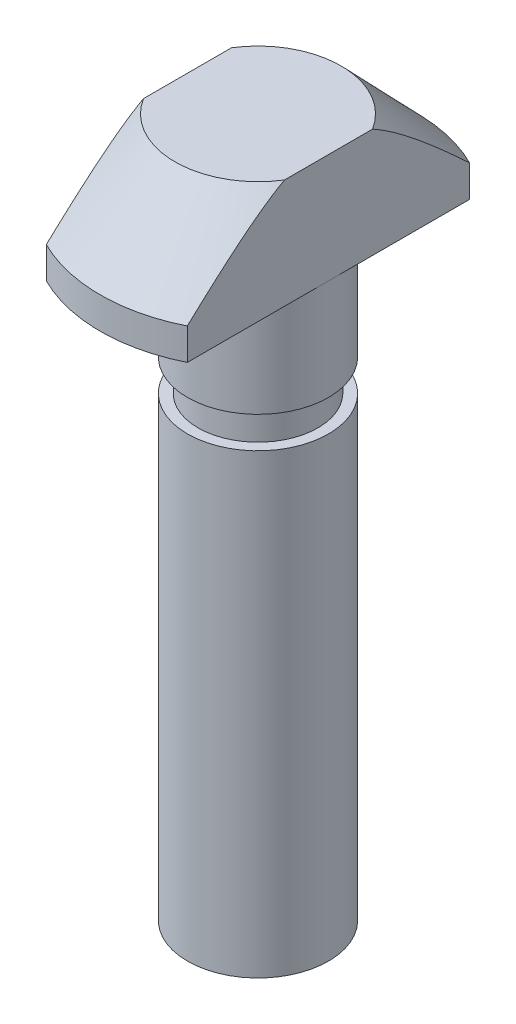
ISO-10303-21;
HEADER;
FILE_DESCRIPTION(('STEP AP214'),'2;1');
FILE_NAME('part.step','',(''),(''),'','','');
FILE_SCHEMA(('AUTOMOTIVE_DESIGN { 1 0 10303 214 1 1 1 1 }'));
ENDSEC;
DATA;
#1=APPLICATION_CONTEXT('core data for automotive mechanical design processes');
#2=APPLICATION_PROTOCOL_DEFINITION('international standard','automotive_design',2000,#1);
#3=PRODUCT_CONTEXT('',#1,'mechanical');
#4=PRODUCT('Part','Part','',(#3));
#5=PRODUCT_RELATED_PRODUCT_CATEGORY('part','',(#4));
#6=PRODUCT_DEFINITION_FORMATION('','',#4);
#7=PRODUCT_DEFINITION_CONTEXT('part definition',#1,'design');
#8=PRODUCT_DEFINITION('design','',#6,#7);
#9=PRODUCT_DEFINITION_SHAPE('','',#8);
#10=(LENGTH_UNIT() NAMED_UNIT(*) SI_UNIT(.MILLI.,.METRE.));
#11=(NAMED_UNIT(*) PLANE_ANGLE_UNIT() SI_UNIT($,.RADIAN.));
#12=(NAMED_UNIT(*) SI_UNIT($,.STERADIAN.) SOLID_ANGLE_UNIT());
#13=UNCERTAINTY_MEASURE_WITH_UNIT(LENGTH_MEASURE(1.E-05),#10,'distance_accuracy_value','');
#14=(GEOMETRIC_REPRESENTATION_CONTEXT(3) GLOBAL_UNCERTAINTY_ASSIGNED_CONTEXT((#13)) GLOBAL_UNIT_ASSIGNED_CONTEXT((#10,
#11,#12)) REPRESENTATION_CONTEXT('',''));
#15=CARTESIAN_POINT('',(0.,0.,0.));
#16=DIRECTION('',(0.,0.,1.));
#17=DIRECTION('',(1.,0.,0.));
#18=AXIS2_PLACEMENT_3D('',#15,#16,#17);
#19=CARTESIAN_POINT('',(0.,29.5,0.));
#20=DIRECTION('',(0.,-1.,0.));
#21=DIRECTION('',(0.,0.,-1.));
#22=AXIS2_PLACEMENT_3D('',#19,#20,#21);
#23=CONICAL_SURFACE('',#22,7.5,0.764711459617608);
#24=CARTESIAN_POINT('',(0.,29.5,0.));
#25=DIRECTION('',(0.,1.,0.));
#26=DIRECTION('',(0.,0.,1.));
#27=AXIS2_PLACEMENT_3D('',#24,#25,#26);
#28=CIRCLE('',#27,7.5);
#29=CARTESIAN_POINT('',(-3.34999999999999,29.5,6.71025334842136));
#30=VERTEX_POINT('',#29);
#31=CARTESIAN_POINT('',(3.34999999999999,29.5,6.71025334842138));
#32=VERTEX_POINT('',#31);
#33=EDGE_CURVE('E119',#30,#32,#28,.T.);
#34=ORIENTED_EDGE('',*,*,#33,.T.);
#35=CARTESIAN_POINT('',(3.34999999999999,20.2300427216243,16.0482271665102));
#36=CARTESIAN_POINT('',(3.34999999999999,20.6380891410871,15.6482633282209));
#37=CARTESIAN_POINT('',(3.34999999999999,21.0458438123531,15.2480010140229));
#38=CARTESIAN_POINT('',(3.34999999999999,21.8611691703313,14.4460761519081));
#39=CARTESIAN_POINT('',(3.34999999999999,22.2687386790002,14.044412406466));
#40=CARTESIAN_POINT('',(3.34999999999999,23.0934251490443,13.2296498679263));
#41=CARTESIAN_POINT('',(3.34999999999999,23.5105158381261,12.8165244684015));
#42=CARTESIAN_POINT('',(3.34999999999999,24.3426792592591,11.9894882411883));
#43=CARTESIAN_POINT('',(3.34999999999999,24.7577540768003,11.5755795132965));
#44=CARTESIAN_POINT('',(3.34999999999999,25.5435970847149,10.788362588637));
#45=CARTESIAN_POINT('',(3.34999999999999,25.9145490311669,10.4152379865853));
#46=CARTESIAN_POINT('',(3.34999999999999,26.6544441356383,9.66687328399124));
#47=CARTESIAN_POINT('',(3.34999999999999,27.0233869351847,9.29163282877394));
#48=CARTESIAN_POINT('',(3.34999999999999,27.7605535362416,8.53607849582722));
#49=CARTESIAN_POINT('',(3.34999999999999,28.128760073513,8.1557477247362));
#50=CARTESIAN_POINT('',(3.34999999999999,28.6776769145847,7.58224470195402));
#51=CARTESIAN_POINT('',(3.34999999999999,28.8600240910318,7.39063960240931));
#52=CARTESIAN_POINT('',(3.34999999999999,29.2233541715714,7.00614108804007));
#53=CARTESIAN_POINT('',(3.34999999999999,29.404337084556,6.81324768162787));
#54=CARTESIAN_POINT('',(3.34999999999999,29.7603089909152,6.43046109785213));
#55=CARTESIAN_POINT('',(3.34999999999999,29.9353382705544,6.24060543027114));
#56=CARTESIAN_POINT('',(3.34999999999999,30.2833112886384,5.85897258279413));
#57=CARTESIAN_POINT('',(3.34999999999999,30.4562549295409,5.66719531378965));
#58=CARTESIAN_POINT('',(3.34999999999999,30.7998598760466,5.28068996131222));
#59=CARTESIAN_POINT('',(3.34999999999999,30.9705139131704,5.08595540143413));
#60=CARTESIAN_POINT('',(3.34999999999999,31.3081057307192,4.69332709268464));
#61=CARTESIAN_POINT('',(3.34999999999999,31.4750440546433,4.49543381320914));
#62=CARTESIAN_POINT('',(3.34999999999999,31.8019010106499,4.09773246298403));
#63=CARTESIAN_POINT('',(3.34999999999999,31.9618784378439,3.89797288223986));
#64=CARTESIAN_POINT('',(3.34999999999999,32.2748149796803,3.49274390059992));
#65=CARTESIAN_POINT('',(3.34999999999999,32.4277693517236,3.28727078749268));
#66=CARTESIAN_POINT('',(3.34999999999999,32.6487781623789,2.97382615314163));
#67=CARTESIAN_POINT('',(3.34999999999999,32.7208890214445,2.86871776387192));
#68=CARTESIAN_POINT('',(3.34999999999999,32.8617748673896,2.65625686425381));
#69=CARTESIAN_POINT('',(3.34999999999999,32.9305494356166,2.54890407467433));
#70=CARTESIAN_POINT('',(3.34999999999999,33.0638050992787,2.33175601750872));
#71=CARTESIAN_POINT('',(3.34999999999999,33.1282918837402,2.22196425501377));
#72=CARTESIAN_POINT('',(3.34999999999999,33.2519302034503,1.99943155215));
#73=CARTESIAN_POINT('',(3.34999999999999,33.311083813302,1.88669178076409));
#74=CARTESIAN_POINT('',(3.34999999999999,33.3787832693683,1.74778811183083));
#75=CARTESIAN_POINT('',(3.34999999999999,33.3905770738496,1.72319341589388));
#76=CARTESIAN_POINT('',(3.34999999999999,33.4138363359891,1.67384492483455));
#77=CARTESIAN_POINT('',(3.34999999999999,33.4253017485224,1.649091108414));
#78=CARTESIAN_POINT('',(3.34999999999999,33.4591837205587,1.57457795367186));
#79=CARTESIAN_POINT('',(3.34999999999999,33.4810794402449,1.52458035662323));
#80=CARTESIAN_POINT('',(3.34999999999999,33.5233304187146,1.42393877890141));
#81=CARTESIAN_POINT('',(3.34999999999999,33.5436857384073,1.37329482387862));
#82=CARTESIAN_POINT('',(3.34999999999999,33.5826932964747,1.27136009093699));
#83=CARTESIAN_POINT('',(3.34999999999999,33.6013456197307,1.22006934540097));
#84=CARTESIAN_POINT('',(3.34999999999999,33.6539873483949,1.06670320255995));
#85=CARTESIAN_POINT('',(3.34999999999999,33.6852814265867,0.963678336467478));
#86=CARTESIAN_POINT('',(3.34999999999999,33.73924397427,0.755338595083958));
#87=CARTESIAN_POINT('',(3.34999999999999,33.7619099877068,0.650023076743854));
#88=CARTESIAN_POINT('',(3.34999999999999,33.7977540856108,0.435387260073001));
#89=CARTESIAN_POINT('',(3.34999999999999,33.8107139800739,0.326029740578949));
#90=CARTESIAN_POINT('',(3.34999999999999,33.8254480680524,0.106590090374744));
#91=CARTESIAN_POINT('',(3.34999999999999,33.8272263453762,-0.0034917610849074));
#92=CARTESIAN_POINT('',(3.34999999999999,33.8194783893568,-0.223301554861784));
#93=CARTESIAN_POINT('',(3.34999999999999,33.8099468876167,-0.333029308348022));
#94=CARTESIAN_POINT('',(3.34999999999999,33.7802285114262,-0.551039190091791));
#95=CARTESIAN_POINT('',(3.34999999999999,33.7600378191914,-0.659320786125009));
#96=CARTESIAN_POINT('',(3.34999999999999,33.7045986184295,-0.897809406924326));
#97=CARTESIAN_POINT('',(3.34999999999999,33.6669828158505,-1.02746142700182));
#98=CARTESIAN_POINT('',(3.34999999999999,33.5802358897141,-1.28281632743857));
#99=CARTESIAN_POINT('',(3.34999999999999,33.5311001296731,-1.40851759456076));
#100=CARTESIAN_POINT('',(3.34999999999999,33.4234739250976,-1.65678482448423));
#101=CARTESIAN_POINT('',(3.34999999999999,33.3649241262183,-1.77932475420384));
#102=CARTESIAN_POINT('',(3.34999999999999,33.2718334091075,-1.96036200010969));
#103=CARTESIAN_POINT('',(3.34999999999999,33.2399281432508,-2.0202411644373));
#104=CARTESIAN_POINT('',(3.34999999999999,33.1745644843029,-2.13914496242085));
#105=CARTESIAN_POINT('',(3.34999999999999,33.141106131472,-2.19816961817599));
#106=CARTESIAN_POINT('',(3.34999999999999,33.0405936826991,-2.37078031648078));
#107=CARTESIAN_POINT('',(3.34999999999999,32.9716456722641,-2.48326461135518));
#108=CARTESIAN_POINT('',(3.34999999999999,32.8297117136947,-2.70566621750447));
#109=CARTESIAN_POINT('',(3.34999999999999,32.7567249460468,-2.81558300131756));
#110=CARTESIAN_POINT('',(3.34999999999999,32.6075020362671,-3.03329399998297));
#111=CARTESIAN_POINT('',(3.34999999999999,32.5312636584932,-3.14108667746095));
#112=CARTESIAN_POINT('',(3.34999999999999,32.3762078454924,-3.35480496101115));
#113=CARTESIAN_POINT('',(3.34999999999999,32.2973902267042,-3.46073043336771));
#114=CARTESIAN_POINT('',(3.34999999999999,32.0574393418787,-3.77663595013612));
#115=CARTESIAN_POINT('',(3.34999999999999,31.8931676627904,-3.98423057279263));
#116=CARTESIAN_POINT('',(3.34999999999999,31.5589450605226,-4.39479691663773));
#117=CARTESIAN_POINT('',(3.34999999999999,31.3889934004019,-4.59776803216609));
#118=CARTESIAN_POINT('',(3.34999999999999,31.1305355066406,-4.90018219285906));
#119=CARTESIAN_POINT('',(3.34999999999999,31.043545130904,-5.00092655347041));
#120=CARTESIAN_POINT('',(3.34999999999999,30.8686864329241,-5.20163840994283));
#121=CARTESIAN_POINT('',(3.34999999999999,30.7808181706404,-5.30160595804222));
#122=CARTESIAN_POINT('',(3.34999999999999,30.5160603542808,-5.60052678033644));
#123=CARTESIAN_POINT('',(3.34999999999999,30.3380369779588,-5.79847587254366));
#124=CARTESIAN_POINT('',(3.34999999999999,29.9800246562448,-6.191956967731));
#125=CARTESIAN_POINT('',(3.34999999999999,29.8000396432523,-6.38749255926918));
#126=CARTESIAN_POINT('',(3.34999999999999,29.4383043501696,-6.77692361500832));
#127=CARTESIAN_POINT('',(3.34999999999999,29.2565540624755,-6.97081907213758));
#128=CARTESIAN_POINT('',(3.34999999999999,28.7107248738905,-7.54896679966747));
#129=CARTESIAN_POINT('',(3.34999999999999,28.344596962417,-7.93128340042693));
#130=CARTESIAN_POINT('',(3.34999999999999,27.6087556188866,-8.6924573626329));
#131=CARTESIAN_POINT('',(3.34999999999999,27.2390420897582,-9.07131462988473));
#132=CARTESIAN_POINT('',(3.34999999999999,26.4968464697829,-9.82685013078058));
#133=CARTESIAN_POINT('',(3.34999999999999,26.1243625514278,-10.2035265675708));
#134=CARTESIAN_POINT('',(3.34999999999999,25.3775895645495,-10.9550857449051));
#135=CARTESIAN_POINT('',(3.34999999999999,25.0033004910598,-11.3299684805083));
#136=CARTESIAN_POINT('',(3.34999999999999,24.2635382374122,-12.0682403406247));
#137=CARTESIAN_POINT('',(3.34999999999999,23.8981010813989,-12.4316655834247));
#138=CARTESIAN_POINT('',(3.34999999999999,23.1662411440838,-13.1575245618995));
#139=CARTESIAN_POINT('',(3.34999999999999,22.7998183591493,-13.5199582939101));
#140=CARTESIAN_POINT('',(3.34999999999999,22.0665216257546,-14.2437245990499));
#141=CARTESIAN_POINT('',(3.34999999999999,21.6996483552503,-14.6050578593324));
#142=CARTESIAN_POINT('',(3.34999999999999,20.9652778021539,-15.3270851031951));
#143=CARTESIAN_POINT('',(3.34999999999999,20.5977805235541,-15.6877790908353));
#144=CARTESIAN_POINT('',(3.34999999999999,20.2300427216243,-16.0482271665101));
#145=B_SPLINE_CURVE_WITH_KNOTS('',3,(#35,#36,#37,#38,#39,#40,#41,#42,#43,#44,#45,#46,#47,#48,
#49,#50,#51,#52,#53,#54,#55,#56,#57,#58,#59,#60,#61,#62,#63,#64,#65,#66,#67,#68,#69,#70,#71,#72,
#73,#74,#75,#76,#77,#78,#79,#80,#81,#82,#83,#84,#85,#86,#87,#88,#89,#90,#91,#92,#93,#94,#95,#96,
#97,#98,#99,#100,#101,#102,#103,#104,#105,#106,#107,#108,#109,#110,#111,#112,#113,#114,#115,
#116,#117,#118,#119,#120,#121,#122,#123,#124,#125,#126,#127,#128,#129,#130,#131,#132,#133,#134,
#135,#136,#137,#138,#139,#140,#141,#142,#143,#144),.UNSPECIFIED.,.F.,.F.,(4,2,2,2,2,2,2,2,2,2,2,
2,2,2,2,2,2,2,2,2,2,2,2,2,2,2,2,2,2,2,2,2,2,2,2,2,2,2,2,2,2,2,2,2,2,2,2,2,2,2,2,2,2,2,4),(0.,
1.71413506995679,3.43082254703922,5.19199442914468,6.9505314107815,8.5289567265738,
10.1076549994087,11.6957232371131,12.4892338614989,13.2827393095068,14.057403989371,
14.8321047597678,15.6088598902287,16.3855006476079,17.1531742330324,17.9213588177228,
18.3037108897573,18.6861108175638,19.0679928129606,19.4497256096037,19.531552678457,
19.613390937859,19.7771123446089,19.9408272742387,20.1045340394552,20.427211507954,
20.7499807608819,21.0798042928811,21.40950735801,21.739364067939,22.0693390023298,
22.4736378817979,22.8780997612462,23.2852196522347,23.4887484500406,23.6922719747727,
24.0879528373321,24.4837142849183,24.8797523685725,25.2758186993099,26.0698330352931,
26.8639507925709,27.2632591323186,27.6625403832691,28.4611913053835,29.2584608216411,
30.0557337737019,31.6437541383505,33.2318176152536,34.8210428576701,36.4102724750356,
37.9564265979586,39.5025864274418,41.0473896261241,42.5921829781482),.UNSPECIFIED.);
#146=CARTESIAN_POINT('',(3.34999999999999,33.2,2.09284495364562));
#147=VERTEX_POINT('',#146);
#148=EDGE_CURVE('E115',#32,#147,#145,.T.);
#149=ORIENTED_EDGE('',*,*,#148,.T.);
#150=CARTESIAN_POINT('',(0.,33.2,0.));
#151=DIRECTION('',(0.,1.,0.));
#152=DIRECTION('',(0.,0.,1.));
#153=AXIS2_PLACEMENT_3D('',#150,#151,#152);
#154=CIRCLE('',#153,3.94999999999999);
#155=CARTESIAN_POINT('',(-3.34999999999999,33.2,2.09284495364563));
#156=VERTEX_POINT('',#155);
#157=EDGE_CURVE('E153',#156,#147,#154,.T.);
#158=ORIENTED_EDGE('',*,*,#157,.F.);
#159=CARTESIAN_POINT('',(-3.34999999999999,20.2300427216243,-16.0482271665102));
#160=CARTESIAN_POINT('',(-3.34999999999999,20.6380891410871,-15.6482633282209));
#161=CARTESIAN_POINT('',(-3.34999999999999,21.0458438123531,-15.2480010140229));
#162=CARTESIAN_POINT('',(-3.34999999999999,21.8611691703313,-14.4460761519081));
#163=CARTESIAN_POINT('',(-3.34999999999999,22.2687386790002,-14.044412406466));
#164=CARTESIAN_POINT('',(-3.34999999999999,23.0934251490443,-13.2296498679263));
#165=CARTESIAN_POINT('',(-3.34999999999999,23.5105158381261,-12.8165244684015));
#166=CARTESIAN_POINT('',(-3.34999999999999,24.3426792592591,-11.9894882411883));
#167=CARTESIAN_POINT('',(-3.34999999999999,24.7577540768003,-11.5755795132965));
#168=CARTESIAN_POINT('',(-3.34999999999999,25.5435970847149,-10.788362588637));
#169=CARTESIAN_POINT('',(-3.34999999999999,25.9145490311669,-10.4152379865853));
#170=CARTESIAN_POINT('',(-3.34999999999999,26.6544441356383,-9.66687328399124));
#171=CARTESIAN_POINT('',(-3.34999999999999,27.0233869351847,-9.29163282877394));
#172=CARTESIAN_POINT('',(-3.34999999999999,27.7605535362416,-8.53607849582722));
#173=CARTESIAN_POINT('',(-3.34999999999999,28.128760073513,-8.1557477247362));
#174=CARTESIAN_POINT('',(-3.34999999999999,28.6776769145847,-7.58224470195402));
#175=CARTESIAN_POINT('',(-3.34999999999999,28.8600240910318,-7.39063960240931));
#176=CARTESIAN_POINT('',(-3.34999999999999,29.2233541715714,-7.00614108804007));
#177=CARTESIAN_POINT('',(-3.34999999999999,29.404337084556,-6.81324768162787));
#178=CARTESIAN_POINT('',(-3.34999999999999,29.7603089909152,-6.43046109785213));
#179=CARTESIAN_POINT('',(-3.34999999999999,29.9353382705544,-6.24060543027114));
#180=CARTESIAN_POINT('',(-3.34999999999999,30.2833112886384,-5.85897258279413));
#181=CARTESIAN_POINT('',(-3.34999999999999,30.4562549295409,-5.66719531378965));
#182=CARTESIAN_POINT('',(-3.34999999999999,30.7998598760466,-5.28068996131222));
#183=CARTESIAN_POINT('',(-3.34999999999999,30.9705139131704,-5.08595540143413));
#184=CARTESIAN_POINT('',(-3.34999999999999,31.3081057307192,-4.69332709268464));
#185=CARTESIAN_POINT('',(-3.34999999999999,31.4750440546433,-4.49543381320914));
#186=CARTESIAN_POINT('',(-3.34999999999999,31.8019010106499,-4.09773246298403));
#187=CARTESIAN_POINT('',(-3.34999999999999,31.9618784378439,-3.89797288223986));
#188=CARTESIAN_POINT('',(-3.34999999999999,32.2748149796803,-3.49274390059992));
#189=CARTESIAN_POINT('',(-3.34999999999999,32.4277693517236,-3.28727078749268));
#190=CARTESIAN_POINT('',(-3.34999999999999,32.6487781623789,-2.97382615314163));
#191=CARTESIAN_POINT('',(-3.34999999999999,32.7208890214445,-2.86871776387192));
#192=CARTESIAN_POINT('',(-3.34999999999999,32.8617748673896,-2.65625686425381));
#193=CARTESIAN_POINT('',(-3.34999999999999,32.9305494356166,-2.54890407467433));
#194=CARTESIAN_POINT('',(-3.34999999999999,33.0638050992787,-2.33175601750872));
#195=CARTESIAN_POINT('',(-3.34999999999999,33.1282918837402,-2.22196425501377));
#196=CARTESIAN_POINT('',(-3.34999999999999,33.2519302034503,-1.99943155215));
#197=CARTESIAN_POINT('',(-3.34999999999999,33.311083813302,-1.88669178076409));
#198=CARTESIAN_POINT('',(-3.34999999999999,33.3787832693683,-1.74778811183083));
#199=CARTESIAN_POINT('',(-3.34999999999999,33.3905770738496,-1.72319341589388));
#200=CARTESIAN_POINT('',(-3.34999999999999,33.4138363359891,-1.67384492483455));
#201=CARTESIAN_POINT('',(-3.34999999999999,33.4253017485224,-1.649091108414));
#202=CARTESIAN_POINT('',(-3.34999999999999,33.4591837205587,-1.57457795367186));
#203=CARTESIAN_POINT('',(-3.34999999999999,33.4810794402449,-1.52458035662323));
#204=CARTESIAN_POINT('',(-3.34999999999999,33.5233304187146,-1.42393877890141));
#205=CARTESIAN_POINT('',(-3.34999999999999,33.5436857384073,-1.37329482387862));
#206=CARTESIAN_POINT('',(-3.34999999999999,33.5826932964747,-1.27136009093699));
#207=CARTESIAN_POINT('',(-3.34999999999999,33.6013456197307,-1.22006934540097));
#208=CARTESIAN_POINT('',(-3.34999999999999,33.6539873483949,-1.06670320255995));
#209=CARTESIAN_POINT('',(-3.34999999999999,33.6852814265867,-0.963678336467478));
#210=CARTESIAN_POINT('',(-3.34999999999999,33.73924397427,-0.755338595083958));
#211=CARTESIAN_POINT('',(-3.34999999999999,33.7619099877068,-0.650023076743854));
#212=CARTESIAN_POINT('',(-3.34999999999999,33.7977540856108,-0.435387260073001));
#213=CARTESIAN_POINT('',(-3.34999999999999,33.8107139800739,-0.326029740578949));
#214=CARTESIAN_POINT('',(-3.34999999999999,33.8254480680524,-0.106590090374744));
#215=CARTESIAN_POINT('',(-3.34999999999999,33.8272263453762,0.0034917610849074));
#216=CARTESIAN_POINT('',(-3.34999999999999,33.8194783893568,0.223301554861784));
#217=CARTESIAN_POINT('',(-3.34999999999999,33.8099468876167,0.333029308348022));
#218=CARTESIAN_POINT('',(-3.34999999999999,33.7802285114262,0.551039190091791));
#219=CARTESIAN_POINT('',(-3.34999999999999,33.7600378191914,0.659320786125009));
#220=CARTESIAN_POINT('',(-3.34999999999999,33.7045986184295,0.897809406924326));
#221=CARTESIAN_POINT('',(-3.34999999999999,33.6669828158505,1.02746142700182));
#222=CARTESIAN_POINT('',(-3.34999999999999,33.5802358897141,1.28281632743857));
#223=CARTESIAN_POINT('',(-3.34999999999999,33.5311001296731,1.40851759456076));
#224=CARTESIAN_POINT('',(-3.34999999999999,33.4234739250976,1.65678482448423));
#225=CARTESIAN_POINT('',(-3.34999999999999,33.3649241262183,1.77932475420384));
#226=CARTESIAN_POINT('',(-3.34999999999999,33.2718334091075,1.96036200010969));
#227=CARTESIAN_POINT('',(-3.34999999999999,33.2399281432508,2.0202411644373));
#228=CARTESIAN_POINT('',(-3.34999999999999,33.1745644843029,2.13914496242085));
#229=CARTESIAN_POINT('',(-3.34999999999999,33.141106131472,2.19816961817599));
#230=CARTESIAN_POINT('',(-3.34999999999999,33.0405936826991,2.37078031648078));
#231=CARTESIAN_POINT('',(-3.34999999999999,32.9716456722641,2.48326461135518));
#232=CARTESIAN_POINT('',(-3.34999999999999,32.8297117136947,2.70566621750447));
#233=CARTESIAN_POINT('',(-3.34999999999999,32.7567249460468,2.81558300131756));
#234=CARTESIAN_POINT('',(-3.34999999999999,32.6075020362671,3.03329399998297));
#235=CARTESIAN_POINT('',(-3.34999999999999,32.5312636584932,3.14108667746095));
#236=CARTESIAN_POINT('',(-3.34999999999999,32.3762078454924,3.35480496101115));
#237=CARTESIAN_POINT('',(-3.34999999999999,32.2973902267042,3.46073043336771));
#238=CARTESIAN_POINT('',(-3.34999999999999,32.0574393418787,3.77663595013612));
#239=CARTESIAN_POINT('',(-3.34999999999999,31.8931676627904,3.98423057279263));
#240=CARTESIAN_POINT('',(-3.34999999999999,31.5589450605226,4.39479691663773));
#241=CARTESIAN_POINT('',(-3.34999999999999,31.3889934004019,4.59776803216609));
#242=CARTESIAN_POINT('',(-3.34999999999999,31.1305355066406,4.90018219285906));
#243=CARTESIAN_POINT('',(-3.34999999999999,31.043545130904,5.00092655347041));
#244=CARTESIAN_POINT('',(-3.34999999999999,30.8686864329241,5.20163840994283));
#245=CARTESIAN_POINT('',(-3.34999999999999,30.7808181706404,5.30160595804222));
#246=CARTESIAN_POINT('',(-3.34999999999999,30.5160603542808,5.60052678033644));
#247=CARTESIAN_POINT('',(-3.34999999999999,30.3380369779588,5.79847587254366));
#248=CARTESIAN_POINT('',(-3.34999999999999,29.9800246562448,6.191956967731));
#249=CARTESIAN_POINT('',(-3.34999999999999,29.8000396432523,6.38749255926918));
#250=CARTESIAN_POINT('',(-3.34999999999999,29.4383043501696,6.77692361500832));
#251=CARTESIAN_POINT('',(-3.34999999999999,29.2565540624755,6.97081907213758));
#252=CARTESIAN_POINT('',(-3.34999999999999,28.7107248738905,7.54896679966747));
#253=CARTESIAN_POINT('',(-3.34999999999999,28.344596962417,7.93128340042693));
#254=CARTESIAN_POINT('',(-3.34999999999999,27.6087556188866,8.6924573626329));
#255=CARTESIAN_POINT('',(-3.34999999999999,27.2390420897582,9.07131462988473));
#256=CARTESIAN_POINT('',(-3.34999999999999,26.4968464697829,9.82685013078058));
#257=CARTESIAN_POINT('',(-3.34999999999999,26.1243625514278,10.2035265675708));
#258=CARTESIAN_POINT('',(-3.34999999999999,25.3775895645495,10.9550857449051));
#259=CARTESIAN_POINT('',(-3.34999999999999,25.0033004910598,11.3299684805083));
#260=CARTESIAN_POINT('',(-3.34999999999999,24.2635382374122,12.0682403406247));
#261=CARTESIAN_POINT('',(-3.34999999999999,23.8981010813989,12.4316655834247));
#262=CARTESIAN_POINT('',(-3.34999999999999,23.1662411440838,13.1575245618995));
#263=CARTESIAN_POINT('',(-3.34999999999999,22.7998183591493,13.5199582939101));
#264=CARTESIAN_POINT('',(-3.34999999999999,22.0665216257546,14.2437245990499));
#265=CARTESIAN_POINT('',(-3.34999999999999,21.6996483552503,14.6050578593324));
#266=CARTESIAN_POINT('',(-3.34999999999999,20.9652778021539,15.3270851031951));
#267=CARTESIAN_POINT('',(-3.34999999999999,20.5977805235541,15.6877790908353));
#268=CARTESIAN_POINT('',(-3.34999999999999,20.2300427216243,16.0482271665101));
#269=B_SPLINE_CURVE_WITH_KNOTS('',3,(#159,#160,#161,#162,#163,#164,#165,#166,#167,#168,#169,
#170,#171,#172,#173,#174,#175,#176,#177,#178,#179,#180,#181,#182,#183,#184,#185,#186,#187,#188,
#189,#190,#191,#192,#193,#194,#195,#196,#197,#198,#199,#200,#201,#202,#203,#204,#205,#206,#207,
#208,#209,#210,#211,#212,#213,#214,#215,#216,#217,#218,#219,#220,#221,#222,#223,#224,#225,#226,
#227,#228,#229,#230,#231,#232,#233,#234,#235,#236,#237,#238,#239,#240,#241,#242,#243,#244,#245,
#246,#247,#248,#249,#250,#251,#252,#253,#254,#255,#256,#257,#258,#259,#260,#261,#262,#263,#264,
#265,#266,#267,#268),.UNSPECIFIED.,.F.,.F.,(4,2,2,2,2,2,2,2,2,2,2,2,2,2,2,2,2,2,2,2,2,2,2,2,2,2,
2,2,2,2,2,2,2,2,2,2,2,2,2,2,2,2,2,2,2,2,2,2,2,2,2,2,2,2,4),(0.,1.71413506995679,
3.43082254703922,5.19199442914468,6.9505314107815,8.5289567265738,10.1076549994087,
11.6957232371131,12.4892338614989,13.2827393095068,14.057403989371,14.8321047597678,
15.6088598902287,16.3855006476079,17.1531742330324,17.9213588177228,18.3037108897573,
18.6861108175638,19.0679928129606,19.4497256096037,19.531552678457,19.613390937859,
19.7771123446089,19.9408272742387,20.1045340394552,20.427211507954,20.7499807608819,
21.0798042928811,21.40950735801,21.739364067939,22.0693390023298,22.4736378817979,
22.8780997612462,23.2852196522347,23.4887484500406,23.6922719747727,24.0879528373321,
24.4837142849183,24.8797523685725,25.2758186993099,26.0698330352931,26.8639507925709,
27.2632591323186,27.6625403832691,28.4611913053835,29.2584608216411,30.0557337737019,
31.6437541383505,33.2318176152536,34.8210428576701,36.4102724750356,37.9564265979586,
39.5025864274418,41.0473896261241,42.5921829781482),.UNSPECIFIED.);
#270=EDGE_CURVE('E168',#156,#30,#269,.T.);
#271=ORIENTED_EDGE('',*,*,#270,.T.);
#272=EDGE_LOOP('',(#34,#149,#158,#271));
#273=FACE_BOUND('',#272,.T.);
#274=ADVANCED_FACE('F35',(#273),#23,.T.);
#275=CARTESIAN_POINT('',(7.5,28.,0.));
#276=DIRECTION('',(0.,1.,0.));
#277=DIRECTION('',(0.,0.,1.));
#278=AXIS2_PLACEMENT_3D('',#275,#276,#277);
#279=PLANE('',#278);
#280=CARTESIAN_POINT('',(0.,28.,0.));
#281=DIRECTION('',(0.,1.,0.));
#282=DIRECTION('',(0.,0.,1.));
#283=AXIS2_PLACEMENT_3D('',#280,#281,#282);
#284=CIRCLE('',#283,7.5);
#285=CARTESIAN_POINT('',(3.34999999999999,28.,-6.71025334842136));
#286=VERTEX_POINT('',#285);
#287=CARTESIAN_POINT('',(-3.34999999999999,28.,-6.71025334842136));
#288=VERTEX_POINT('',#287);
#289=EDGE_CURVE('E123',#286,#288,#284,.T.);
#290=ORIENTED_EDGE('',*,*,#289,.F.);
#291=DIRECTION('',(0.,0.,1.));
#292=VECTOR('',#291,1.);
#293=CARTESIAN_POINT('',(3.34999999999999,28.,0.));
#294=LINE('',#293,#292);
#295=CARTESIAN_POINT('',(3.34999999999999,28.,0.));
#296=VERTEX_POINT('',#295);
#297=EDGE_CURVE('E55',#286,#296,#294,.T.);
#298=ORIENTED_EDGE('',*,*,#297,.T.);
#299=CARTESIAN_POINT('',(0.,28.,0.));
#300=DIRECTION('',(0.,1.,0.));
#301=DIRECTION('',(0.,0.,1.));
#302=AXIS2_PLACEMENT_3D('',#299,#300,#301);
#303=CIRCLE('',#302,3.34999999999999);
#304=CARTESIAN_POINT('',(-3.35,28.,0.));
#305=VERTEX_POINT('',#304);
#306=EDGE_CURVE('E134',#296,#305,#303,.T.);
#307=ORIENTED_EDGE('',*,*,#306,.T.);
#308=DIRECTION('',(0.,0.,-1.));
#309=VECTOR('',#308,1.);
#310=CARTESIAN_POINT('',(-3.35,28.,0.));
#311=LINE('',#310,#309);
#312=EDGE_CURVE('E120',#305,#288,#311,.T.);
#313=ORIENTED_EDGE('',*,*,#312,.T.);
#314=EDGE_LOOP('',(#290,#298,#307,#313));
#315=FACE_BOUND('',#314,.T.);
#316=ADVANCED_FACE('F201',(#315),#279,.F.);
#317=CARTESIAN_POINT('',(0.,33.2,0.));
#318=DIRECTION('',(0.,1.,0.));
#319=DIRECTION('',(0.,0.,1.));
#320=AXIS2_PLACEMENT_3D('',#317,#318,#319);
#321=CYLINDRICAL_SURFACE('',#320,7.5);
#322=CARTESIAN_POINT('',(-3.34999999999999,28.,6.71025334842136));
#323=VERTEX_POINT('',#322);
#324=CARTESIAN_POINT('',(3.34999999999999,28.,6.71025334842136));
#325=VERTEX_POINT('',#324);
#326=EDGE_CURVE('E131',#323,#325,#284,.T.);
#327=ORIENTED_EDGE('',*,*,#326,.T.);
#328=DIRECTION('',(0.,1.,0.));
#329=VECTOR('',#328,1.);
#330=CARTESIAN_POINT('',(3.34999999999999,33.2,6.71025334842136));
#331=LINE('',#330,#329);
#332=EDGE_CURVE('E48',#325,#32,#331,.T.);
#333=ORIENTED_EDGE('',*,*,#332,.T.);
#334=ORIENTED_EDGE('',*,*,#33,.F.);
#335=DIRECTION('',(0.,1.,0.));
#336=VECTOR('',#335,1.);
#337=CARTESIAN_POINT('',(-3.34999999999999,33.2,6.71025334842136));
#338=LINE('',#337,#336);
#339=EDGE_CURVE('E156',#30,#323,#338,.F.);
#340=ORIENTED_EDGE('',*,*,#339,.T.);
#341=EDGE_LOOP('',(#327,#333,#334,#340));
#342=FACE_BOUND('',#341,.T.);
#343=ADVANCED_FACE('F161',(#342),#321,.T.);
#344=CARTESIAN_POINT('',(3.34999999999999,33.2,-2.09284495364563));
#345=VERTEX_POINT('',#344);
#346=CARTESIAN_POINT('',(-3.34999999999999,33.2,-2.09284495364562));
#347=VERTEX_POINT('',#346);
#348=EDGE_CURVE('E112',#345,#347,#154,.T.);
#349=ORIENTED_EDGE('',*,*,#348,.F.);
#350=CARTESIAN_POINT('',(3.34999999999999,29.5,-6.71025334842136));
#351=VERTEX_POINT('',#350);
#352=EDGE_CURVE('E100',#345,#351,#145,.T.);
#353=ORIENTED_EDGE('',*,*,#352,.T.);
#354=CARTESIAN_POINT('',(-3.34999999999999,29.5,-6.71025334842138));
#355=VERTEX_POINT('',#354);
#356=EDGE_CURVE('E110',#351,#355,#28,.T.);
#357=ORIENTED_EDGE('',*,*,#356,.T.);
#358=EDGE_CURVE('E125',#355,#347,#269,.T.);
#359=ORIENTED_EDGE('',*,*,#358,.T.);
#360=EDGE_LOOP('',(#349,#353,#357,#359));
#361=FACE_BOUND('',#360,.T.);
#362=ADVANCED_FACE('F37',(#361),#23,.T.);
#363=CARTESIAN_POINT('',(3.94999999999999,33.2,0.));
#364=DIRECTION('',(0.,-1.,0.));
#365=DIRECTION('',(0.,0.,-1.));
#366=AXIS2_PLACEMENT_3D('',#363,#364,#365);
#367=PLANE('',#366);
#368=ORIENTED_EDGE('',*,*,#157,.T.);
#369=DIRECTION('',(0.,0.,-1.));
#370=VECTOR('',#369,1.);
#371=CARTESIAN_POINT('',(3.34999999999999,33.2,0.));
#372=LINE('',#371,#370);
#373=EDGE_CURVE('E113',#147,#345,#372,.T.);
#374=ORIENTED_EDGE('',*,*,#373,.T.);
#375=ORIENTED_EDGE('',*,*,#348,.T.);
#376=DIRECTION('',(0.,0.,1.));
#377=VECTOR('',#376,1.);
#378=CARTESIAN_POINT('',(-3.34999999999999,33.2,0.));
#379=LINE('',#378,#377);
#380=EDGE_CURVE('E129',#347,#156,#379,.T.);
#381=ORIENTED_EDGE('',*,*,#380,.T.);
#382=EDGE_LOOP('',(#368,#374,#375,#381));
#383=FACE_BOUND('',#382,.T.);
#384=ADVANCED_FACE('F178',(#383),#367,.F.);
#385=CARTESIAN_POINT('',(0.,0.,0.));
#386=DIRECTION('',(0.,1.,0.));
#387=DIRECTION('',(0.,0.,1.));
#388=AXIS2_PLACEMENT_3D('',#385,#386,#387);
#389=PLANE('',#388);
#390=CARTESIAN_POINT('',(0.,0.,0.));
#391=DIRECTION('',(0.,1.,0.));
#392=DIRECTION('',(0.,0.,1.));
#393=AXIS2_PLACEMENT_3D('',#390,#391,#392);
#394=CIRCLE('',#393,3.34999999999999);
#395=CARTESIAN_POINT('',(0.,0.,3.34999999999999));
#396=VERTEX_POINT('',#395);
#397=EDGE_CURVE('E150',#396,#396,#394,.T.);
#398=ORIENTED_EDGE('',*,*,#397,.F.);
#399=EDGE_LOOP('',(#398));
#400=FACE_BOUND('',#399,.T.);
#401=ADVANCED_FACE('F220',(#400),#389,.F.);
#402=CARTESIAN_POINT('',(0.,33.2,0.));
#403=DIRECTION('',(0.,1.,0.));
#404=DIRECTION('',(0.,0.,1.));
#405=AXIS2_PLACEMENT_3D('',#402,#403,#404);
#406=CYLINDRICAL_SURFACE('',#405,3.34999999999999);
#407=CARTESIAN_POINT('',(-1.71254715821342,3.31583402863609,-2.87918082853666));
#408=CARTESIAN_POINT('',(-1.6273891486123,3.18212877638971,-2.9298408439506));
#409=CARTESIAN_POINT('',(-1.53218870434466,3.05503302949912,-2.98139821439001));
#410=CARTESIAN_POINT('',(-1.3196779139157,2.81902705359817,-3.08134513379594));
#411=CARTESIAN_POINT('',(-1.20239922608068,2.71009120143776,-3.1297390865992));
#412=CARTESIAN_POINT('',(-0.996246306160638,2.55719518995586,-3.19947427986328));
#413=CARTESIAN_POINT('',(-0.914776300064414,2.50467497057459,-3.22389331996445));
#414=CARTESIAN_POINT('',(-0.743849586378248,2.41183326134112,-3.26755953877373));
#415=CARTESIAN_POINT('',(-0.654401830710456,2.37149831586961,-3.2868124195796));
#416=CARTESIAN_POINT('',(-0.467857108262387,2.30549790660227,-3.31852901163961));
#417=CARTESIAN_POINT('',(-0.370687733315472,2.2799962031914,-3.33091686429542));
#418=CARTESIAN_POINT('',(-0.17264863229365,2.24691771292528,-3.34701587797021));
#419=CARTESIAN_POINT('',(-0.0717832540778524,2.2393205103319,-3.35073692132518));
#420=CARTESIAN_POINT('',(0.115243698937967,2.24259950903012,-3.34913647343574));
#421=CARTESIAN_POINT('',(0.201470032357771,2.25101823576412,-3.34501784408665));
#422=CARTESIAN_POINT('',(0.37106890713756,2.28091035734283,-3.33047458500192));
#423=CARTESIAN_POINT('',(0.454440116823403,2.30238975859732,-3.3200470539073));
#424=CARTESIAN_POINT('',(0.633548530244793,2.36263832357282,-3.29104839798392));
#425=CARTESIAN_POINT('',(0.72816689159916,2.40410519187898,-3.2712205575452));
#426=CARTESIAN_POINT('',(0.908632792135474,2.5006353373114,-3.22577004816605));
#427=CARTESIAN_POINT('',(0.994466069246033,2.55572024255327,-3.200138166766));
#428=CARTESIAN_POINT('',(1.19019166017422,2.70126048187434,-3.13377945011315));
#429=CARTESIAN_POINT('',(1.29552591155638,2.79695925254369,-3.09117159695676));
#430=CARTESIAN_POINT('',(1.48869285973316,3.00338424087282,-3.00293424262392));
#431=CARTESIAN_POINT('',(1.57648463277377,3.11414460702104,-2.9572979993086));
#432=CARTESIAN_POINT('',(1.76597796789082,3.39081409218336,-2.84952007046018));
#433=CARTESIAN_POINT('',(1.8604851468852,3.56179336038828,-2.78762858945377));
#434=CARTESIAN_POINT('',(1.98113262743908,3.82966552230466,-2.70185651605915));
#435=CARTESIAN_POINT('',(2.01784906160027,3.92092912392691,-2.67442553202198));
#436=CARTESIAN_POINT('',(2.08441605217758,4.10688194820744,-2.62287764401332));
#437=CARTESIAN_POINT('',(2.11426658267362,4.20157118379657,-2.5987607525533));
#438=CARTESIAN_POINT('',(2.1674165089632,4.39484137872921,-2.55460611243567));
#439=CARTESIAN_POINT('',(2.19064241123102,4.49345313304449,-2.53461475819781));
#440=CARTESIAN_POINT('',(2.2300682922734,4.69295971454443,-2.49999713148197));
#441=CARTESIAN_POINT('',(2.2462716731839,4.79385341123383,-2.48536826162168));
#442=CARTESIAN_POINT('',(2.27156333632043,4.99705191109878,-2.46227429023577));
#443=CARTESIAN_POINT('',(2.28066413377568,5.09935390747241,-2.45379834868674));
#444=CARTESIAN_POINT('',(2.29172606814598,5.30467339868827,-2.44347107963444));
#445=CARTESIAN_POINT('',(2.29368796118312,5.40769081659807,-2.44161905055518));
#446=CARTESIAN_POINT('',(2.29057723785847,5.60584305537064,-2.44453619467091));
#447=CARTESIAN_POINT('',(2.28601737586895,5.70099383041434,-2.44882276992875));
#448=CARTESIAN_POINT('',(2.27080402807336,5.89038682622339,-2.46293645617005));
#449=CARTESIAN_POINT('',(2.26015060899961,5.98462905692696,-2.47276350647815));
#450=CARTESIAN_POINT('',(2.23279378446932,6.17168784421295,-2.497493094155));
#451=CARTESIAN_POINT('',(2.2160820252195,6.26450224686027,-2.51240263802841));
#452=CARTESIAN_POINT('',(2.17666611212855,6.44803591866937,-2.54662531203544));
#453=CARTESIAN_POINT('',(2.15395951121142,6.53875431576507,-2.56594023999417));
#454=CARTESIAN_POINT('',(2.07674302529374,6.80756135932132,-2.62947190208555));
#455=CARTESIAN_POINT('',(2.0132019750848,6.98185053345833,-2.67920950964761));
#456=CARTESIAN_POINT('',(1.86146771549996,7.3165753571391,-2.78677025463266));
#457=CARTESIAN_POINT('',(1.77328830602353,7.47701869605771,-2.84458885687127));
#458=CARTESIAN_POINT('',(1.59547126732429,7.74177251751113,-2.94698370454259));
#459=CARTESIAN_POINT('',(1.51167092297893,7.85010877643603,-2.99127009375183));
#460=CARTESIAN_POINT('',(1.32766932167192,8.05301846479307,-3.07734976966057));
#461=CARTESIAN_POINT('',(1.22749778859801,8.14761626084677,-3.11914739077767));
#462=CARTESIAN_POINT('',(1.03946861990315,8.2947169699928,-3.18575958133924));
#463=CARTESIAN_POINT('',(0.955658492756913,8.35167411339982,-3.21210312014554));
#464=CARTESIAN_POINT('',(0.779149261984087,8.45265346845826,-3.25940691660664));
#465=CARTESIAN_POINT('',(0.686462991930645,8.49669399196381,-3.28037478996291));
#466=CARTESIAN_POINT('',(0.509947435645684,8.56253700950734,-3.31195982385662));
#467=CARTESIAN_POINT('',(0.427264587031717,8.58683859617059,-3.32372681746213));
#468=CARTESIAN_POINT('',(0.258527386427841,8.622578259038,-3.34108296223552));
#469=CARTESIAN_POINT('',(0.172475492120295,8.63402553782895,-3.34667653299775));
#470=CARTESIAN_POINT('',(-0.000770405272347766,8.64313046975501,-3.35112291159804));
#471=CARTESIAN_POINT('',(-0.0879668132460368,8.64075185016822,-3.34995798830856));
#472=CARTESIAN_POINT('',(-0.260550650546185,8.62232864770877,-3.34097136313407));
#473=CARTESIAN_POINT('',(-0.345937411639978,8.60627910379449,-3.33314724469462));
#474=CARTESIAN_POINT('',(-0.509911836383107,8.56251086064312,-3.31196587274915));
#475=CARTESIAN_POINT('',(-0.588629486926944,8.53518060924393,-3.29879302618445));
#476=CARTESIAN_POINT('',(-0.740890471405241,8.4705882245413,-3.26797000364651));
#477=CARTESIAN_POINT('',(-0.814431749769138,8.43332217348069,-3.25031806166662));
#478=CARTESIAN_POINT('',(-0.994330201791428,8.32791671079952,-3.20103692806894));
#479=CARTESIAN_POINT('',(-1.09667605850527,8.25403107719356,-3.16703903843299));
#480=CARTESIAN_POINT('',(-1.28729561625828,8.09173511736245,-3.09448468509828));
#481=CARTESIAN_POINT('',(-1.37552892440941,8.00328451970558,-3.05591566773497));
#482=CARTESIAN_POINT('',(-1.57469877852904,7.77401450055721,-2.95971086267111));
#483=CARTESIAN_POINT('',(-1.67846115711108,7.62731477230798,-2.90117478723745));
#484=CARTESIAN_POINT('',(-1.81517282373987,7.3954595025159,-2.816117133681));
#485=CARTESIAN_POINT('',(-1.85762402365319,7.31611371421874,-2.78819334982841));
#486=CARTESIAN_POINT('',(-1.93646937813565,7.1539149365921,-2.73402135626989));
#487=CARTESIAN_POINT('',(-1.97286366326964,7.07106202291167,-2.70777311045304));
#488=CARTESIAN_POINT('',(-2.07519306539224,6.81285557167338,-2.6312560574431));
#489=CARTESIAN_POINT('',(-2.13165355566878,6.63236215041796,-2.58494844611673));
#490=CARTESIAN_POINT('',(-2.19776609059675,6.35494883334248,-2.52846631743755));
#491=CARTESIAN_POINT('',(-2.21670359045958,6.26140207641714,-2.51180599639445));
#492=CARTESIAN_POINT('',(-2.24836910074546,6.07252122344044,-2.48350439046443));
#493=CARTESIAN_POINT('',(-2.26109986960686,5.97718794096716,-2.47186087624143));
#494=CARTESIAN_POINT('',(-2.28067824676873,5.78146516411405,-2.45381186384514));
#495=CARTESIAN_POINT('',(-2.28726503491741,5.6810279128946,-2.44763909697303));
#496=CARTESIAN_POINT('',(-2.29359113510883,5.47974372011126,-2.44171226692467));
#497=CARTESIAN_POINT('',(-2.29333027975099,5.37889676859192,-2.44195836066678));
#498=CARTESIAN_POINT('',(-2.28595711246431,5.17755430587062,-2.44886232527604));
#499=CARTESIAN_POINT('',(-2.27883675371138,5.07705934656141,-2.45552772657464));
#500=CARTESIAN_POINT('',(-2.25779465287225,4.87740006035129,-2.47488559141415));
#501=CARTESIAN_POINT('',(-2.24387302791145,4.77823571056603,-2.48757795116401));
#502=CARTESIAN_POINT('',(-2.19489392448961,4.50013280825476,-2.53116310860076));
#503=CARTESIAN_POINT('',(-2.15188956955373,4.32351923513011,-2.56841088960832));
#504=CARTESIAN_POINT('',(-2.04359556395783,3.98102347517455,-2.65537170930962));
#505=CARTESIAN_POINT('',(-1.97835155729202,3.81512012996283,-2.70505916216857));
#506=CARTESIAN_POINT('',(-1.84496378278718,3.53866893951855,-2.79701973007089));
#507=CARTESIAN_POINT('',(-1.78210556678766,3.42504659252572,-2.83780092702128));
#508=CARTESIAN_POINT('',(-1.71254715821342,3.31583402863609,-2.87918082853666));
#509=B_SPLINE_CURVE_WITH_KNOTS('',3,(#407,#408,#409,#410,#411,#412,#413,#414,#415,#416,#417,
#418,#419,#420,#421,#422,#423,#424,#425,#426,#427,#428,#429,#430,#431,#432,#433,#434,#435,#436,
#437,#438,#439,#440,#441,#442,#443,#444,#445,#446,#447,#448,#449,#450,#451,#452,#453,#454,#455,
#456,#457,#458,#459,#460,#461,#462,#463,#464,#465,#466,#467,#468,#469,#470,#471,#472,#473,#474,
#475,#476,#477,#478,#479,#480,#481,#482,#483,#484,#485,#486,#487,#488,#489,#490,#491,#492,#493,
#494,#495,#496,#497,#498,#499,#500,#501,#502,#503,#504,#505,#506,#507,#508),.UNSPECIFIED.,.T.,
.F.,(4,2,2,2,2,2,2,2,2,2,2,2,2,2,2,2,2,2,2,2,2,2,2,2,2,2,2,2,2,2,2,2,2,2,2,2,2,2,2,2,2,2,2,2,2,
2,2,2,2,2,4),(0.,0.498918720192882,0.997127408564257,1.29604182113007,1.59462493993805,
1.89644476932153,2.19792027957135,2.45681823976498,2.71583535342125,3.02968960863988,
3.3440455648353,3.78724465711666,4.23146589068595,4.8428234993968,5.14895933033943,
5.45509631698389,5.76450806658884,6.07376975033,6.38248525605774,6.69116806301357,
6.9768735767696,7.26257596174159,7.54867380713706,7.8348886178453,8.40868518151638,
8.98216100481153,9.41275319349213,9.84257210199877,10.1556251065045,10.4682321272684,
10.7280634780284,10.9877086928966,11.2480354028828,11.5084566230935,11.7605730816574,
12.0127890989517,12.4027414204027,12.7937906259424,13.3574810566984,13.6399436196914,
13.9224000930399,14.5036382302946,14.7940382808721,15.0843091519323,15.3864060914527,
15.6885104161777,15.9909695689673,16.2934235132564,16.8477076854655,17.4008610433369,
17.8083857418012),.UNSPECIFIED.);
#510=CARTESIAN_POINT('',(-1.71254715821342,3.31583402863609,-2.87918082853666));
#511=VERTEX_POINT('',#510);
#512=EDGE_CURVE('E11',#511,#511,#509,.T.);
#513=ORIENTED_EDGE('',*,*,#512,.T.);
#514=EDGE_LOOP('',(#513));
#515=FACE_BOUND('',#514,.T.);
#516=CARTESIAN_POINT('',(0.,21.7,0.));
#517=DIRECTION('',(0.,1.,0.));
#518=DIRECTION('',(0.,0.,1.));
#519=AXIS2_PLACEMENT_3D('',#516,#517,#518);
#520=CIRCLE('',#519,3.34999999999999);
#521=CARTESIAN_POINT('',(0.,21.7,3.34999999999999));
#522=VERTEX_POINT('',#521);
#523=EDGE_CURVE('E147',#522,#522,#520,.T.);
#524=ORIENTED_EDGE('',*,*,#523,.F.);
#525=EDGE_LOOP('',(#524));
#526=FACE_BOUND('',#525,.T.);
#527=ORIENTED_EDGE('',*,*,#397,.T.);
#528=EDGE_LOOP('',(#527));
#529=FACE_BOUND('',#528,.T.);
#530=ADVANCED_FACE('F215',(#515,#526,#529),#406,.T.);
#531=CARTESIAN_POINT('',(2.84999999999999,21.7,0.));
#532=DIRECTION('',(0.,-1.,0.));
#533=DIRECTION('',(0.,0.,-1.));
#534=AXIS2_PLACEMENT_3D('',#531,#532,#533);
#535=PLANE('',#534);
#536=CARTESIAN_POINT('',(0.,21.7,0.));
#537=DIRECTION('',(0.,1.,0.));
#538=DIRECTION('',(0.,0.,1.));
#539=AXIS2_PLACEMENT_3D('',#536,#537,#538);
#540=CIRCLE('',#539,2.84999999999999);
#541=CARTESIAN_POINT('',(0.,21.7,2.84999999999999));
#542=VERTEX_POINT('',#541);
#543=EDGE_CURVE('E144',#542,#542,#540,.T.);
#544=ORIENTED_EDGE('',*,*,#543,.F.);
#545=EDGE_LOOP('',(#544));
#546=FACE_BOUND('',#545,.T.);
#547=ORIENTED_EDGE('',*,*,#523,.T.);
#548=EDGE_LOOP('',(#547));
#549=FACE_BOUND('',#548,.T.);
#550=ADVANCED_FACE('F212',(#546,#549),#535,.F.);
#551=CARTESIAN_POINT('',(0.,33.2,0.));
#552=DIRECTION('',(0.,1.,0.));
#553=DIRECTION('',(0.,0.,1.));
#554=AXIS2_PLACEMENT_3D('',#551,#552,#553);
#555=CYLINDRICAL_SURFACE('',#554,2.84999999999999);
#556=CARTESIAN_POINT('',(0.,23.2,0.));
#557=DIRECTION('',(0.,1.,0.));
#558=DIRECTION('',(0.,0.,1.));
#559=AXIS2_PLACEMENT_3D('',#556,#557,#558);
#560=CIRCLE('',#559,2.84999999999999);
#561=CARTESIAN_POINT('',(0.,23.2,2.84999999999999));
#562=VERTEX_POINT('',#561);
#563=EDGE_CURVE('E141',#562,#562,#560,.T.);
#564=ORIENTED_EDGE('',*,*,#563,.F.);
#565=EDGE_LOOP('',(#564));
#566=FACE_BOUND('',#565,.T.);
#567=ORIENTED_EDGE('',*,*,#543,.T.);
#568=EDGE_LOOP('',(#567));
#569=FACE_BOUND('',#568,.T.);
#570=ADVANCED_FACE('F208',(#566,#569),#555,.T.);
#571=CARTESIAN_POINT('',(2.84999999999999,23.2,0.));
#572=DIRECTION('',(0.,1.,0.));
#573=DIRECTION('',(0.,0.,1.));
#574=AXIS2_PLACEMENT_3D('',#571,#572,#573);
#575=PLANE('',#574);
#576=CARTESIAN_POINT('',(0.,23.2,0.));
#577=DIRECTION('',(0.,1.,0.));
#578=DIRECTION('',(0.,0.,1.));
#579=AXIS2_PLACEMENT_3D('',#576,#577,#578);
#580=CIRCLE('',#579,3.34999999999999);
#581=CARTESIAN_POINT('',(0.,23.2,3.34999999999999));
#582=VERTEX_POINT('',#581);
#583=EDGE_CURVE('E138',#582,#582,#580,.T.);
#584=ORIENTED_EDGE('',*,*,#583,.F.);
#585=EDGE_LOOP('',(#584));
#586=FACE_BOUND('',#585,.T.);
#587=ORIENTED_EDGE('',*,*,#563,.T.);
#588=EDGE_LOOP('',(#587));
#589=FACE_BOUND('',#588,.T.);
#590=ADVANCED_FACE('F204',(#586,#589),#575,.F.);
#591=CARTESIAN_POINT('',(0.,33.2,0.));
#592=DIRECTION('',(0.,1.,0.));
#593=DIRECTION('',(0.,0.,1.));
#594=AXIS2_PLACEMENT_3D('',#591,#592,#593);
#595=CYLINDRICAL_SURFACE('',#594,3.34999999999999);
#596=ORIENTED_EDGE('',*,*,#306,.F.);
#597=EDGE_CURVE('E135',#305,#296,#303,.T.);
#598=ORIENTED_EDGE('',*,*,#597,.F.);
#599=EDGE_LOOP('',(#596,#598));
#600=FACE_BOUND('',#599,.T.);
#601=ORIENTED_EDGE('',*,*,#583,.T.);
#602=EDGE_LOOP('',(#601));
#603=FACE_BOUND('',#602,.T.);
#604=ADVANCED_FACE('F199',(#600,#603),#595,.T.);
#605=ORIENTED_EDGE('',*,*,#597,.T.);
#606=EDGE_CURVE('E171',#296,#325,#294,.T.);
#607=ORIENTED_EDGE('',*,*,#606,.T.);
#608=ORIENTED_EDGE('',*,*,#326,.F.);
#609=EDGE_CURVE('E63',#323,#305,#311,.T.);
#610=ORIENTED_EDGE('',*,*,#609,.T.);
#611=EDGE_LOOP('',(#605,#607,#608,#610));
#612=FACE_BOUND('',#611,.T.);
#613=ADVANCED_FACE('F196',(#612),#279,.F.);
#614=ORIENTED_EDGE('',*,*,#356,.F.);
#615=DIRECTION('',(0.,1.,0.));
#616=VECTOR('',#615,1.);
#617=CARTESIAN_POINT('',(3.34999999999999,33.2,-6.71025334842136));
#618=LINE('',#617,#616);
#619=EDGE_CURVE('E97',#351,#286,#618,.F.);
#620=ORIENTED_EDGE('',*,*,#619,.T.);
#621=ORIENTED_EDGE('',*,*,#289,.T.);
#622=DIRECTION('',(0.,1.,0.));
#623=VECTOR('',#622,1.);
#624=CARTESIAN_POINT('',(-3.34999999999999,33.2,-6.71025334842136));
#625=LINE('',#624,#623);
#626=EDGE_CURVE('E105',#288,#355,#625,.T.);
#627=ORIENTED_EDGE('',*,*,#626,.T.);
#628=EDGE_LOOP('',(#614,#620,#621,#627));
#629=FACE_BOUND('',#628,.T.);
#630=ADVANCED_FACE('F117',(#629),#321,.T.);
#631=CARTESIAN_POINT('',(-3.34999999999999,24.8210347379003,-50.));
#632=DIRECTION('',(1.,0.,0.));
#633=DIRECTION('',(0.,0.,-1.));
#634=AXIS2_PLACEMENT_3D('',#631,#632,#633);
#635=PLANE('',#634);
#636=ORIENTED_EDGE('',*,*,#609,.F.);
#637=ORIENTED_EDGE('',*,*,#339,.F.);
#638=ORIENTED_EDGE('',*,*,#270,.F.);
#639=ORIENTED_EDGE('',*,*,#380,.F.);
#640=ORIENTED_EDGE('',*,*,#358,.F.);
#641=ORIENTED_EDGE('',*,*,#626,.F.);
#642=ORIENTED_EDGE('',*,*,#312,.F.);
#643=EDGE_LOOP('',(#636,#637,#638,#639,#640,#641,#642));
#644=FACE_BOUND('',#643,.T.);
#645=ADVANCED_FACE('F176',(#644),#635,.F.);
#646=CARTESIAN_POINT('',(3.34999999999999,24.5416791885542,-50.));
#647=DIRECTION('',(-1.,0.,0.));
#648=DIRECTION('',(0.,0.,1.));
#649=AXIS2_PLACEMENT_3D('',#646,#647,#648);
#650=PLANE('',#649);
#651=ORIENTED_EDGE('',*,*,#297,.F.);
#652=ORIENTED_EDGE('',*,*,#619,.F.);
#653=ORIENTED_EDGE('',*,*,#352,.F.);
#654=ORIENTED_EDGE('',*,*,#373,.F.);
#655=ORIENTED_EDGE('',*,*,#148,.F.);
#656=ORIENTED_EDGE('',*,*,#332,.F.);
#657=ORIENTED_EDGE('',*,*,#606,.F.);
#658=EDGE_LOOP('',(#651,#652,#653,#654,#655,#656,#657));
#659=FACE_BOUND('',#658,.T.);
#660=ADVANCED_FACE('F99',(#659),#650,.F.);
#661=CARTESIAN_POINT('',(0.,5.44083054894498,-3.34999999999999));
#662=DIRECTION('',(0.,0.,-1.));
#663=DIRECTION('',(-1.,0.,0.));
#664=AXIS2_PLACEMENT_3D('',#661,#662,#663);
#665=CONICAL_SURFACE('',#664,3.20000000000001,0.785398163397454);
#666=CARTESIAN_POINT('',(0.,5.44083054894498,-1.65000000000001));
#667=DIRECTION('',(0.,0.,-1.));
#668=DIRECTION('',(-1.,0.,0.));
#669=AXIS2_PLACEMENT_3D('',#666,#667,#668);
#670=CIRCLE('',#669,1.5);
#671=CARTESIAN_POINT('',(-1.5,5.44083054894498,-1.65000000000001));
#672=VERTEX_POINT('',#671);
#673=EDGE_CURVE('E249',#672,#672,#670,.T.);
#674=ORIENTED_EDGE('',*,*,#673,.F.);
#675=EDGE_LOOP('',(#674));
#676=FACE_BOUND('',#675,.T.);
#677=ORIENTED_EDGE('',*,*,#512,.F.);
#678=EDGE_LOOP('',(#677));
#679=FACE_BOUND('',#678,.T.);
#680=ADVANCED_FACE('F189',(#676,#679),#665,.F.);
#681=CARTESIAN_POINT('',(0.,6.94083054894499,-1.65000000000001));
#682=DIRECTION('',(0.,0.,1.));
#683=DIRECTION('',(1.,0.,0.));
#684=AXIS2_PLACEMENT_3D('',#681,#682,#683);
#685=PLANE('',#684);
#686=ORIENTED_EDGE('',*,*,#673,.T.);
#687=EDGE_LOOP('',(#686));
#688=FACE_BOUND('',#687,.T.);
#689=ADVANCED_FACE('F190',(#688),#685,.F.);
#690=CLOSED_SHELL('',(#274,#316,#343,#362,#384,#401,#530,#550,#570,#590,#604,#613,#630,#645,
#660,#680,#689));
#691=MANIFOLD_SOLID_BREP('B2',#690);
#692=ADVANCED_BREP_SHAPE_REPRESENTATION('',(#18,#691),#14);
#693=SHAPE_DEFINITION_REPRESENTATION(#9,#692);
ENDSEC;
END-ISO-10303-21;
